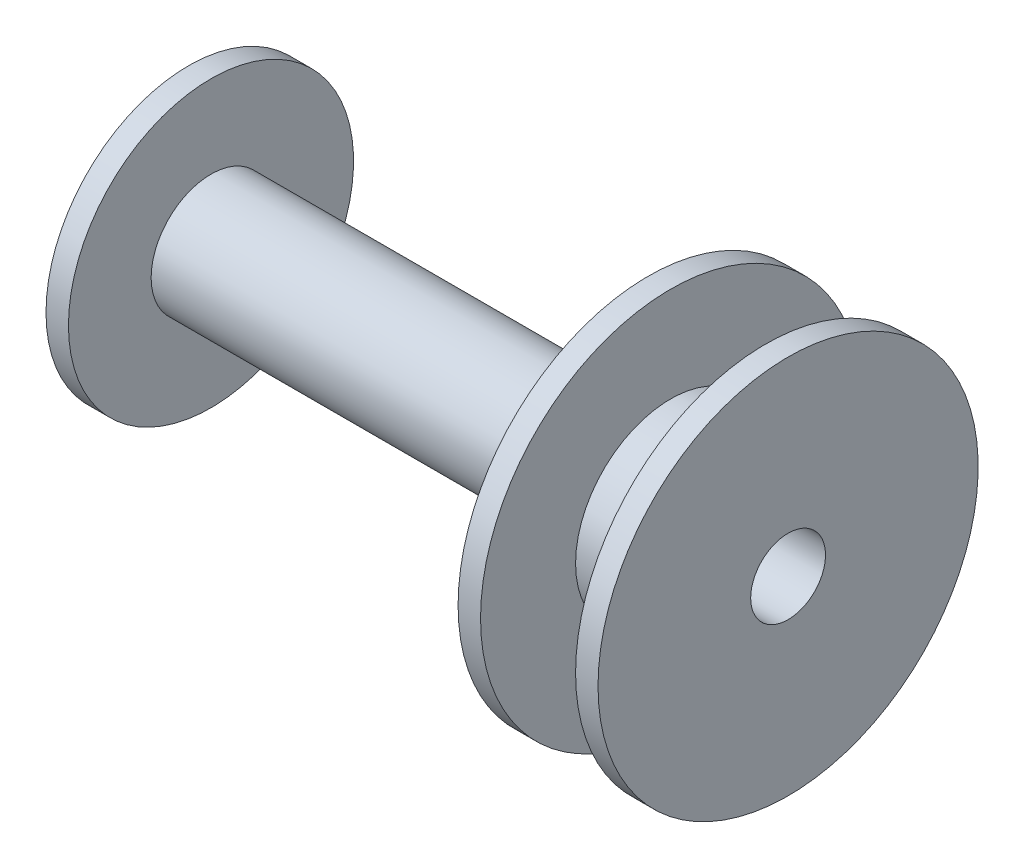
ISO-10303-21;
HEADER;
FILE_DESCRIPTION(('STEP AP214'),'2;1');
FILE_NAME('part.step','',(''),(''),'','','');
FILE_SCHEMA(('AUTOMOTIVE_DESIGN { 1 0 10303 214 1 1 1 1 }'));
ENDSEC;
DATA;
#1=APPLICATION_CONTEXT('core data for automotive mechanical design processes');
#2=APPLICATION_PROTOCOL_DEFINITION('international standard','automotive_design',2000,#1);
#3=PRODUCT_CONTEXT('',#1,'mechanical');
#4=PRODUCT('Part','Part','',(#3));
#5=PRODUCT_RELATED_PRODUCT_CATEGORY('part','',(#4));
#6=PRODUCT_DEFINITION_FORMATION('','',#4);
#7=PRODUCT_DEFINITION_CONTEXT('part definition',#1,'design');
#8=PRODUCT_DEFINITION('design','',#6,#7);
#9=PRODUCT_DEFINITION_SHAPE('','',#8);
#10=(LENGTH_UNIT() NAMED_UNIT(*) SI_UNIT(.MILLI.,.METRE.));
#11=(NAMED_UNIT(*) PLANE_ANGLE_UNIT() SI_UNIT($,.RADIAN.));
#12=(NAMED_UNIT(*) SI_UNIT($,.STERADIAN.) SOLID_ANGLE_UNIT());
#13=UNCERTAINTY_MEASURE_WITH_UNIT(LENGTH_MEASURE(1.E-05),#10,'distance_accuracy_value','');
#14=(GEOMETRIC_REPRESENTATION_CONTEXT(3) GLOBAL_UNCERTAINTY_ASSIGNED_CONTEXT((#13)) GLOBAL_UNIT_ASSIGNED_CONTEXT((#10,
#11,#12)) REPRESENTATION_CONTEXT('',''));
#15=CARTESIAN_POINT('',(0.,0.,0.));
#16=DIRECTION('',(0.,0.,1.));
#17=DIRECTION('',(1.,0.,0.));
#18=AXIS2_PLACEMENT_3D('',#15,#16,#17);
#19=CARTESIAN_POINT('',(-22.8187506369406,0.,0.));
#20=DIRECTION('',(-1.,0.,0.));
#21=DIRECTION('',(0.,0.,1.));
#22=AXIS2_PLACEMENT_3D('',#19,#20,#21);
#23=CYLINDRICAL_SURFACE('',#22,5.);
#24=CARTESIAN_POINT('',(75.2211904761905,0.,0.));
#25=DIRECTION('',(-1.,0.,0.));
#26=DIRECTION('',(0.,0.,1.));
#27=AXIS2_PLACEMENT_3D('',#24,#25,#26);
#28=CIRCLE('',#27,5.);
#29=CARTESIAN_POINT('',(75.2211904761905,0.,5.));
#30=VERTEX_POINT('',#29);
#31=EDGE_CURVE('E77',#30,#30,#28,.T.);
#32=ORIENTED_EDGE('',*,*,#31,.F.);
#33=EDGE_LOOP('',(#32));
#34=FACE_BOUND('',#33,.T.);
#35=CARTESIAN_POINT('',(-4.89880952380952,0.,0.));
#36=DIRECTION('',(-1.,0.,0.));
#37=DIRECTION('',(0.,0.,1.));
#38=AXIS2_PLACEMENT_3D('',#35,#36,#37);
#39=CIRCLE('',#38,5.);
#40=CARTESIAN_POINT('',(-4.89880952380952,0.,5.));
#41=VERTEX_POINT('',#40);
#42=EDGE_CURVE('E10',#41,#41,#39,.T.);
#43=ORIENTED_EDGE('',*,*,#42,.T.);
#44=EDGE_LOOP('',(#43));
#45=FACE_BOUND('',#44,.T.);
#46=ADVANCED_FACE('F37',(#34,#45),#23,.F.);
#47=CARTESIAN_POINT('',(-4.89880952380952,5.,0.));
#48=DIRECTION('',(1.,0.,0.));
#49=DIRECTION('',(0.,0.,-1.));
#50=AXIS2_PLACEMENT_3D('',#47,#48,#49);
#51=PLANE('',#50);
#52=ORIENTED_EDGE('',*,*,#42,.F.);
#53=EDGE_LOOP('',(#52));
#54=FACE_BOUND('',#53,.T.);
#55=CARTESIAN_POINT('',(-4.89880952380952,0.,0.));
#56=DIRECTION('',(-1.,0.,0.));
#57=DIRECTION('',(0.,0.,1.));
#58=AXIS2_PLACEMENT_3D('',#55,#56,#57);
#59=CIRCLE('',#58,19.05);
#60=CARTESIAN_POINT('',(-4.89880952380952,0.,19.05));
#61=VERTEX_POINT('',#60);
#62=EDGE_CURVE('E43',#61,#61,#59,.T.);
#63=ORIENTED_EDGE('',*,*,#62,.T.);
#64=EDGE_LOOP('',(#63));
#65=FACE_BOUND('',#64,.T.);
#66=ADVANCED_FACE('F84',(#54,#65),#51,.F.);
#67=CARTESIAN_POINT('',(-22.8187506369406,0.,0.));
#68=DIRECTION('',(-1.,0.,0.));
#69=DIRECTION('',(0.,0.,1.));
#70=AXIS2_PLACEMENT_3D('',#67,#68,#69);
#71=CYLINDRICAL_SURFACE('',#70,19.05);
#72=ORIENTED_EDGE('',*,*,#62,.F.);
#73=EDGE_LOOP('',(#72));
#74=FACE_BOUND('',#73,.T.);
#75=CARTESIAN_POINT('',(-1.89880952380952,0.,0.));
#76=DIRECTION('',(-1.,0.,0.));
#77=DIRECTION('',(0.,0.,1.));
#78=AXIS2_PLACEMENT_3D('',#75,#76,#77);
#79=CIRCLE('',#78,19.05);
#80=CARTESIAN_POINT('',(-1.89880952380952,0.,19.05));
#81=VERTEX_POINT('',#80);
#82=EDGE_CURVE('E47',#81,#81,#79,.T.);
#83=ORIENTED_EDGE('',*,*,#82,.T.);
#84=EDGE_LOOP('',(#83));
#85=FACE_BOUND('',#84,.T.);
#86=ADVANCED_FACE('F88',(#74,#85),#71,.T.);
#87=CARTESIAN_POINT('',(-1.89880952380952,19.05,0.));
#88=DIRECTION('',(-1.,0.,0.));
#89=DIRECTION('',(0.,0.,1.));
#90=AXIS2_PLACEMENT_3D('',#87,#88,#89);
#91=PLANE('',#90);
#92=ORIENTED_EDGE('',*,*,#82,.F.);
#93=EDGE_LOOP('',(#92));
#94=FACE_BOUND('',#93,.T.);
#95=CARTESIAN_POINT('',(-1.89880952380952,0.,0.));
#96=DIRECTION('',(-1.,0.,0.));
#97=DIRECTION('',(0.,0.,1.));
#98=AXIS2_PLACEMENT_3D('',#95,#96,#97);
#99=CIRCLE('',#98,8.);
#100=CARTESIAN_POINT('',(-1.89880952380952,0.,8.));
#101=VERTEX_POINT('',#100);
#102=EDGE_CURVE('E51',#101,#101,#99,.T.);
#103=ORIENTED_EDGE('',*,*,#102,.T.);
#104=EDGE_LOOP('',(#103));
#105=FACE_BOUND('',#104,.T.);
#106=ADVANCED_FACE('F93',(#94,#105),#91,.F.);
#107=CARTESIAN_POINT('',(-22.8187506369406,0.,0.));
#108=DIRECTION('',(-1.,0.,0.));
#109=DIRECTION('',(0.,0.,1.));
#110=AXIS2_PLACEMENT_3D('',#107,#108,#109);
#111=CYLINDRICAL_SURFACE('',#110,7.99999999999999);
#112=ORIENTED_EDGE('',*,*,#102,.F.);
#113=EDGE_LOOP('',(#112));
#114=FACE_BOUND('',#113,.T.);
#115=CARTESIAN_POINT('',(56.5211904761905,0.,0.));
#116=DIRECTION('',(-1.,0.,0.));
#117=DIRECTION('',(0.,0.,1.));
#118=AXIS2_PLACEMENT_3D('',#115,#116,#117);
#119=CIRCLE('',#118,7.99999999999999);
#120=CARTESIAN_POINT('',(56.5211904761905,0.,7.99999999999999));
#121=VERTEX_POINT('',#120);
#122=EDGE_CURVE('E56',#121,#121,#119,.T.);
#123=ORIENTED_EDGE('',*,*,#122,.T.);
#124=EDGE_LOOP('',(#123));
#125=FACE_BOUND('',#124,.T.);
#126=ADVANCED_FACE('F99',(#114,#125),#111,.T.);
#127=CARTESIAN_POINT('',(56.5211904761905,7.99999999999999,0.));
#128=DIRECTION('',(1.,0.,0.));
#129=DIRECTION('',(0.,0.,-1.));
#130=AXIS2_PLACEMENT_3D('',#127,#128,#129);
#131=PLANE('',#130);
#132=ORIENTED_EDGE('',*,*,#122,.F.);
#133=EDGE_LOOP('',(#132));
#134=FACE_BOUND('',#133,.T.);
#135=CARTESIAN_POINT('',(56.5211904761905,0.,0.));
#136=DIRECTION('',(-1.,0.,0.));
#137=DIRECTION('',(0.,0.,1.));
#138=AXIS2_PLACEMENT_3D('',#135,#136,#137);
#139=CIRCLE('',#138,25.4);
#140=CARTESIAN_POINT('',(56.5211904761905,0.,25.4));
#141=VERTEX_POINT('',#140);
#142=EDGE_CURVE('E59',#141,#141,#139,.T.);
#143=ORIENTED_EDGE('',*,*,#142,.T.);
#144=EDGE_LOOP('',(#143));
#145=FACE_BOUND('',#144,.T.);
#146=ADVANCED_FACE('F103',(#134,#145),#131,.F.);
#147=CARTESIAN_POINT('',(-22.8187506369406,0.,0.));
#148=DIRECTION('',(-1.,0.,0.));
#149=DIRECTION('',(0.,0.,1.));
#150=AXIS2_PLACEMENT_3D('',#147,#148,#149);
#151=CYLINDRICAL_SURFACE('',#150,25.4);
#152=ORIENTED_EDGE('',*,*,#142,.F.);
#153=EDGE_LOOP('',(#152));
#154=FACE_BOUND('',#153,.T.);
#155=CARTESIAN_POINT('',(59.5211904761905,0.,0.));
#156=DIRECTION('',(-1.,0.,0.));
#157=DIRECTION('',(0.,0.,1.));
#158=AXIS2_PLACEMENT_3D('',#155,#156,#157);
#159=CIRCLE('',#158,25.4);
#160=CARTESIAN_POINT('',(59.5211904761905,0.,25.4));
#161=VERTEX_POINT('',#160);
#162=EDGE_CURVE('E62',#161,#161,#159,.T.);
#163=ORIENTED_EDGE('',*,*,#162,.T.);
#164=EDGE_LOOP('',(#163));
#165=FACE_BOUND('',#164,.T.);
#166=ADVANCED_FACE('F107',(#154,#165),#151,.T.);
#167=CARTESIAN_POINT('',(59.5211904761905,25.4,0.));
#168=DIRECTION('',(-1.,0.,0.));
#169=DIRECTION('',(0.,0.,1.));
#170=AXIS2_PLACEMENT_3D('',#167,#168,#169);
#171=PLANE('',#170);
#172=ORIENTED_EDGE('',*,*,#162,.F.);
#173=EDGE_LOOP('',(#172));
#174=FACE_BOUND('',#173,.T.);
#175=CARTESIAN_POINT('',(59.5211904761905,0.,0.));
#176=DIRECTION('',(-1.,0.,0.));
#177=DIRECTION('',(0.,0.,1.));
#178=AXIS2_PLACEMENT_3D('',#175,#176,#177);
#179=CIRCLE('',#178,12.7);
#180=CARTESIAN_POINT('',(59.5211904761905,0.,12.7));
#181=VERTEX_POINT('',#180);
#182=EDGE_CURVE('E65',#181,#181,#179,.T.);
#183=ORIENTED_EDGE('',*,*,#182,.T.);
#184=EDGE_LOOP('',(#183));
#185=FACE_BOUND('',#184,.T.);
#186=ADVANCED_FACE('F111',(#174,#185),#171,.F.);
#187=CARTESIAN_POINT('',(-22.8187506369406,0.,0.));
#188=DIRECTION('',(-1.,0.,0.));
#189=DIRECTION('',(0.,0.,1.));
#190=AXIS2_PLACEMENT_3D('',#187,#188,#189);
#191=CYLINDRICAL_SURFACE('',#190,12.7);
#192=ORIENTED_EDGE('',*,*,#182,.F.);
#193=EDGE_LOOP('',(#192));
#194=FACE_BOUND('',#193,.T.);
#195=CARTESIAN_POINT('',(72.2211904761905,0.,0.));
#196=DIRECTION('',(-1.,0.,0.));
#197=DIRECTION('',(0.,0.,1.));
#198=AXIS2_PLACEMENT_3D('',#195,#196,#197);
#199=CIRCLE('',#198,12.7);
#200=CARTESIAN_POINT('',(72.2211904761905,0.,12.7));
#201=VERTEX_POINT('',#200);
#202=EDGE_CURVE('E68',#201,#201,#199,.T.);
#203=ORIENTED_EDGE('',*,*,#202,.T.);
#204=EDGE_LOOP('',(#203));
#205=FACE_BOUND('',#204,.T.);
#206=ADVANCED_FACE('F115',(#194,#205),#191,.T.);
#207=CARTESIAN_POINT('',(72.2211904761905,12.7,0.));
#208=DIRECTION('',(1.,0.,0.));
#209=DIRECTION('',(0.,0.,-1.));
#210=AXIS2_PLACEMENT_3D('',#207,#208,#209);
#211=PLANE('',#210);
#212=ORIENTED_EDGE('',*,*,#202,.F.);
#213=EDGE_LOOP('',(#212));
#214=FACE_BOUND('',#213,.T.);
#215=CARTESIAN_POINT('',(72.2211904761905,0.,0.));
#216=DIRECTION('',(-1.,0.,0.));
#217=DIRECTION('',(0.,0.,1.));
#218=AXIS2_PLACEMENT_3D('',#215,#216,#217);
#219=CIRCLE('',#218,25.4);
#220=CARTESIAN_POINT('',(72.2211904761905,0.,25.4));
#221=VERTEX_POINT('',#220);
#222=EDGE_CURVE('E71',#221,#221,#219,.T.);
#223=ORIENTED_EDGE('',*,*,#222,.T.);
#224=EDGE_LOOP('',(#223));
#225=FACE_BOUND('',#224,.T.);
#226=ADVANCED_FACE('F119',(#214,#225),#211,.F.);
#227=CARTESIAN_POINT('',(-22.8187506369406,0.,0.));
#228=DIRECTION('',(-1.,0.,0.));
#229=DIRECTION('',(0.,0.,1.));
#230=AXIS2_PLACEMENT_3D('',#227,#228,#229);
#231=CYLINDRICAL_SURFACE('',#230,25.4);
#232=ORIENTED_EDGE('',*,*,#222,.F.);
#233=EDGE_LOOP('',(#232));
#234=FACE_BOUND('',#233,.T.);
#235=CARTESIAN_POINT('',(75.2211904761905,0.,0.));
#236=DIRECTION('',(-1.,0.,0.));
#237=DIRECTION('',(0.,0.,1.));
#238=AXIS2_PLACEMENT_3D('',#235,#236,#237);
#239=CIRCLE('',#238,25.4);
#240=CARTESIAN_POINT('',(75.2211904761905,0.,25.4));
#241=VERTEX_POINT('',#240);
#242=EDGE_CURVE('E74',#241,#241,#239,.T.);
#243=ORIENTED_EDGE('',*,*,#242,.T.);
#244=EDGE_LOOP('',(#243));
#245=FACE_BOUND('',#244,.T.);
#246=ADVANCED_FACE('F123',(#234,#245),#231,.T.);
#247=CARTESIAN_POINT('',(75.2211904761905,25.4,0.));
#248=DIRECTION('',(-1.,0.,0.));
#249=DIRECTION('',(0.,0.,1.));
#250=AXIS2_PLACEMENT_3D('',#247,#248,#249);
#251=PLANE('',#250);
#252=ORIENTED_EDGE('',*,*,#242,.F.);
#253=EDGE_LOOP('',(#252));
#254=FACE_BOUND('',#253,.T.);
#255=ORIENTED_EDGE('',*,*,#31,.T.);
#256=EDGE_LOOP('',(#255));
#257=FACE_BOUND('',#256,.T.);
#258=ADVANCED_FACE('F81',(#254,#257),#251,.F.);
#259=CLOSED_SHELL('',(#46,#66,#86,#106,#126,#146,#166,#186,#206,#226,#246,#258));
#260=MANIFOLD_SOLID_BREP('B2',#259);
#261=ADVANCED_BREP_SHAPE_REPRESENTATION('',(#18,#260),#14);
#262=SHAPE_DEFINITION_REPRESENTATION(#9,#261);
ENDSEC;
END-ISO-10303-21;
